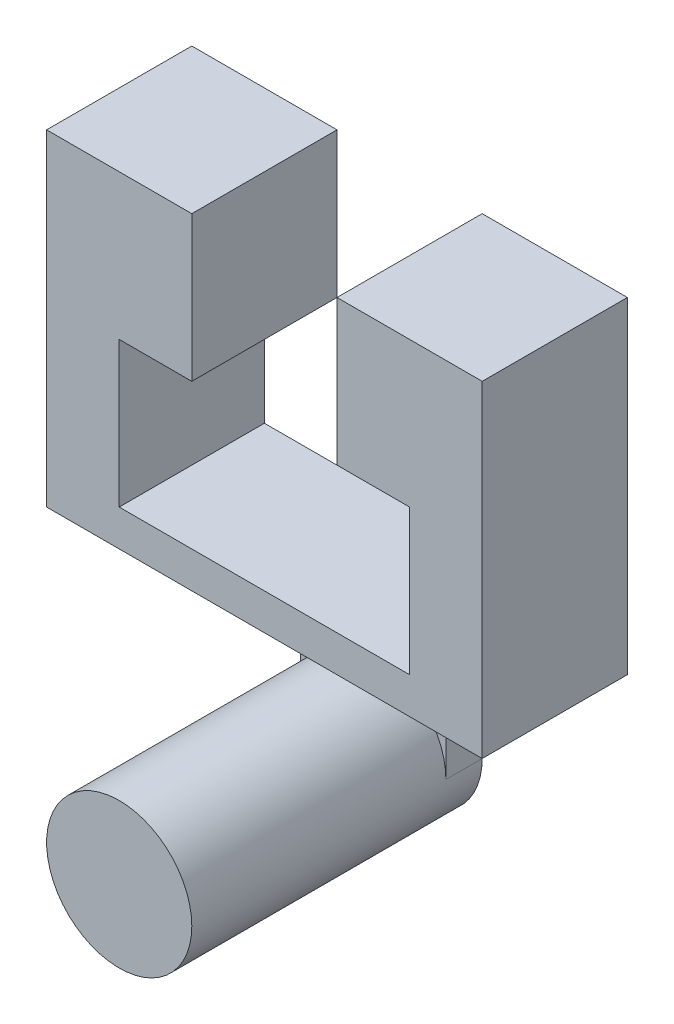
ISO-10303-21;
HEADER;
FILE_DESCRIPTION(('STEP AP214'),'2;1');
FILE_NAME('part.step','',(''),(''),'','','');
FILE_SCHEMA(('AUTOMOTIVE_DESIGN { 1 0 10303 214 1 1 1 1 }'));
ENDSEC;
DATA;
#1=APPLICATION_CONTEXT('core data for automotive mechanical design processes');
#2=APPLICATION_PROTOCOL_DEFINITION('international standard','automotive_design',2000,#1);
#3=PRODUCT_CONTEXT('',#1,'mechanical');
#4=PRODUCT('Part','Part','',(#3));
#5=PRODUCT_RELATED_PRODUCT_CATEGORY('part','',(#4));
#6=PRODUCT_DEFINITION_FORMATION('','',#4);
#7=PRODUCT_DEFINITION_CONTEXT('part definition',#1,'design');
#8=PRODUCT_DEFINITION('design','',#6,#7);
#9=PRODUCT_DEFINITION_SHAPE('','',#8);
#10=(LENGTH_UNIT() NAMED_UNIT(*) SI_UNIT(.MILLI.,.METRE.));
#11=(NAMED_UNIT(*) PLANE_ANGLE_UNIT() SI_UNIT($,.RADIAN.));
#12=(NAMED_UNIT(*) SI_UNIT($,.STERADIAN.) SOLID_ANGLE_UNIT());
#13=UNCERTAINTY_MEASURE_WITH_UNIT(LENGTH_MEASURE(1.E-05),#10,'distance_accuracy_value','');
#14=(GEOMETRIC_REPRESENTATION_CONTEXT(3) GLOBAL_UNCERTAINTY_ASSIGNED_CONTEXT((#13)) GLOBAL_UNIT_ASSIGNED_CONTEXT((#10,
#11,#12)) REPRESENTATION_CONTEXT('',''));
#15=CARTESIAN_POINT('',(0.,0.,0.));
#16=DIRECTION('',(0.,0.,1.));
#17=DIRECTION('',(1.,0.,0.));
#18=AXIS2_PLACEMENT_3D('',#15,#16,#17);
#19=CARTESIAN_POINT('',(38.1,82.55,25.4));
#20=DIRECTION('',(0.,-1.,0.));
#21=DIRECTION('',(0.,0.,-1.));
#22=AXIS2_PLACEMENT_3D('',#19,#20,#21);
#23=PLANE('',#22);
#24=DIRECTION('',(0.,0.,1.));
#25=VECTOR('',#24,1.);
#26=CARTESIAN_POINT('',(-12.7,82.55,0.));
#27=LINE('',#26,#25);
#28=CARTESIAN_POINT('',(-12.7,82.55,0.));
#29=VERTEX_POINT('',#28);
#30=CARTESIAN_POINT('',(-12.7,82.55,25.4));
#31=VERTEX_POINT('',#30);
#32=EDGE_CURVE('E161',#29,#31,#27,.T.);
#33=ORIENTED_EDGE('',*,*,#32,.F.);
#34=DIRECTION('',(-1.,0.,0.));
#35=VECTOR('',#34,1.);
#36=CARTESIAN_POINT('',(38.1,82.55,0.));
#37=LINE('',#36,#35);
#38=CARTESIAN_POINT('',(-38.1,82.55,0.));
#39=VERTEX_POINT('',#38);
#40=EDGE_CURVE('E175',#29,#39,#37,.T.);
#41=ORIENTED_EDGE('',*,*,#40,.T.);
#42=DIRECTION('',(0.,0.,-1.));
#43=VECTOR('',#42,1.);
#44=CARTESIAN_POINT('',(-38.1,82.55,25.4));
#45=LINE('',#44,#43);
#46=CARTESIAN_POINT('',(-38.1,82.55,25.4));
#47=VERTEX_POINT('',#46);
#48=EDGE_CURVE('E188',#47,#39,#45,.T.);
#49=ORIENTED_EDGE('',*,*,#48,.F.);
#50=DIRECTION('',(-1.,0.,0.));
#51=VECTOR('',#50,1.);
#52=CARTESIAN_POINT('',(38.1,82.55,25.4));
#53=LINE('',#52,#51);
#54=EDGE_CURVE('E171',#31,#47,#53,.T.);
#55=ORIENTED_EDGE('',*,*,#54,.F.);
#56=EDGE_LOOP('',(#33,#41,#49,#55));
#57=FACE_BOUND('',#56,.T.);
#58=ADVANCED_FACE('F39',(#57),#23,.F.);
#59=CARTESIAN_POINT('',(0.,0.,0.));
#60=DIRECTION('',(0.,0.,1.));
#61=DIRECTION('',(1.,0.,0.));
#62=AXIS2_PLACEMENT_3D('',#59,#60,#61);
#63=PLANE('',#62);
#64=DIRECTION('',(0.,1.,0.));
#65=VECTOR('',#64,1.);
#66=CARTESIAN_POINT('',(-12.7,57.15,0.));
#67=LINE('',#66,#65);
#68=CARTESIAN_POINT('',(-12.7,57.15,0.));
#69=VERTEX_POINT('',#68);
#70=EDGE_CURVE('E158',#69,#29,#67,.T.);
#71=ORIENTED_EDGE('',*,*,#70,.F.);
#72=DIRECTION('',(1.,0.,0.));
#73=VECTOR('',#72,1.);
#74=CARTESIAN_POINT('',(-25.4,57.15,0.));
#75=LINE('',#74,#73);
#76=CARTESIAN_POINT('',(-25.4,57.15,0.));
#77=VERTEX_POINT('',#76);
#78=EDGE_CURVE('E286',#77,#69,#75,.T.);
#79=ORIENTED_EDGE('',*,*,#78,.F.);
#80=DIRECTION('',(0.,1.,0.));
#81=VECTOR('',#80,1.);
#82=CARTESIAN_POINT('',(-25.4,31.75,0.));
#83=LINE('',#82,#81);
#84=CARTESIAN_POINT('',(-25.4,31.75,0.));
#85=VERTEX_POINT('',#84);
#86=EDGE_CURVE('E289',#85,#77,#83,.T.);
#87=ORIENTED_EDGE('',*,*,#86,.F.);
#88=DIRECTION('',(-1.,0.,0.));
#89=VECTOR('',#88,1.);
#90=CARTESIAN_POINT('',(25.4,31.75,0.));
#91=LINE('',#90,#89);
#92=CARTESIAN_POINT('',(25.4,31.75,0.));
#93=VERTEX_POINT('',#92);
#94=EDGE_CURVE('E283',#93,#85,#91,.T.);
#95=ORIENTED_EDGE('',*,*,#94,.F.);
#96=DIRECTION('',(0.,-1.,0.));
#97=VECTOR('',#96,1.);
#98=CARTESIAN_POINT('',(25.4,57.15,0.));
#99=LINE('',#98,#97);
#100=CARTESIAN_POINT('',(25.4,57.15,0.));
#101=VERTEX_POINT('',#100);
#102=EDGE_CURVE('E282',#101,#93,#99,.T.);
#103=ORIENTED_EDGE('',*,*,#102,.F.);
#104=DIRECTION('',(1.,0.,0.));
#105=VECTOR('',#104,1.);
#106=CARTESIAN_POINT('',(12.7,57.15,0.));
#107=LINE('',#106,#105);
#108=CARTESIAN_POINT('',(12.7,57.15,0.));
#109=VERTEX_POINT('',#108);
#110=EDGE_CURVE('E280',#109,#101,#107,.T.);
#111=ORIENTED_EDGE('',*,*,#110,.F.);
#112=DIRECTION('',(0.,-1.,0.));
#113=VECTOR('',#112,1.);
#114=CARTESIAN_POINT('',(12.7,82.55,0.));
#115=LINE('',#114,#113);
#116=CARTESIAN_POINT('',(12.7,82.55,0.));
#117=VERTEX_POINT('',#116);
#118=EDGE_CURVE('E167',#117,#109,#115,.T.);
#119=ORIENTED_EDGE('',*,*,#118,.F.);
#120=CARTESIAN_POINT('',(38.1,82.55,0.));
#121=VERTEX_POINT('',#120);
#122=EDGE_CURVE('E182',#121,#117,#37,.T.);
#123=ORIENTED_EDGE('',*,*,#122,.F.);
#124=DIRECTION('',(0.,1.,0.));
#125=VECTOR('',#124,1.);
#126=CARTESIAN_POINT('',(38.1,25.4,0.));
#127=LINE('',#126,#125);
#128=CARTESIAN_POINT('',(38.1,25.4,0.));
#129=VERTEX_POINT('',#128);
#130=EDGE_CURVE('E185',#129,#121,#127,.T.);
#131=ORIENTED_EDGE('',*,*,#130,.F.);
#132=DIRECTION('',(1.,0.,0.));
#133=VECTOR('',#132,1.);
#134=CARTESIAN_POINT('',(-38.1,25.4,0.));
#135=LINE('',#134,#133);
#136=CARTESIAN_POINT('',(12.7,25.4,0.));
#137=VERTEX_POINT('',#136);
#138=EDGE_CURVE('E226',#137,#129,#135,.T.);
#139=ORIENTED_EDGE('',*,*,#138,.F.);
#140=DIRECTION('',(0.,-1.,0.));
#141=VECTOR('',#140,1.);
#142=CARTESIAN_POINT('',(12.7,25.4,0.));
#143=LINE('',#142,#141);
#144=CARTESIAN_POINT('',(12.7,0.,0.));
#145=VERTEX_POINT('',#144);
#146=EDGE_CURVE('E206',#137,#145,#143,.T.);
#147=ORIENTED_EDGE('',*,*,#146,.T.);
#148=CARTESIAN_POINT('',(0.,0.,0.));
#149=DIRECTION('',(0.,0.,1.));
#150=DIRECTION('',(1.,0.,0.));
#151=AXIS2_PLACEMENT_3D('',#148,#149,#150);
#152=CIRCLE('',#151,12.7);
#153=CARTESIAN_POINT('',(-12.7,0.,0.));
#154=VERTEX_POINT('',#153);
#155=EDGE_CURVE('E205',#154,#145,#152,.T.);
#156=ORIENTED_EDGE('',*,*,#155,.F.);
#157=DIRECTION('',(0.,1.,0.));
#158=VECTOR('',#157,1.);
#159=CARTESIAN_POINT('',(-12.7,0.,0.));
#160=LINE('',#159,#158);
#161=CARTESIAN_POINT('',(-12.7,25.4,0.));
#162=VERTEX_POINT('',#161);
#163=EDGE_CURVE('E211',#154,#162,#160,.T.);
#164=ORIENTED_EDGE('',*,*,#163,.T.);
#165=CARTESIAN_POINT('',(-38.1,25.4,0.));
#166=VERTEX_POINT('',#165);
#167=EDGE_CURVE('E187',#166,#162,#135,.T.);
#168=ORIENTED_EDGE('',*,*,#167,.F.);
#169=DIRECTION('',(0.,-1.,0.));
#170=VECTOR('',#169,1.);
#171=CARTESIAN_POINT('',(-38.1,82.55,0.));
#172=LINE('',#171,#170);
#173=EDGE_CURVE('E173',#39,#166,#172,.T.);
#174=ORIENTED_EDGE('',*,*,#173,.F.);
#175=ORIENTED_EDGE('',*,*,#40,.F.);
#176=EDGE_LOOP('',(#71,#79,#87,#95,#103,#111,#119,#123,#131,#139,#147,#156,#164,#168,#174,#175));
#177=FACE_BOUND('',#176,.T.);
#178=ADVANCED_FACE('F176',(#177),#63,.F.);
#179=CARTESIAN_POINT('',(0.,0.,25.4));
#180=DIRECTION('',(0.,0.,1.));
#181=DIRECTION('',(1.,0.,0.));
#182=AXIS2_PLACEMENT_3D('',#179,#180,#181);
#183=PLANE('',#182);
#184=DIRECTION('',(1.,0.,0.));
#185=VECTOR('',#184,1.);
#186=CARTESIAN_POINT('',(-25.4,57.15,25.4));
#187=LINE('',#186,#185);
#188=CARTESIAN_POINT('',(-25.4,57.15,25.4));
#189=VERTEX_POINT('',#188);
#190=CARTESIAN_POINT('',(-12.7,57.15,25.4));
#191=VERTEX_POINT('',#190);
#192=EDGE_CURVE('E170',#189,#191,#187,.T.);
#193=ORIENTED_EDGE('',*,*,#192,.T.);
#194=DIRECTION('',(0.,1.,0.));
#195=VECTOR('',#194,1.);
#196=CARTESIAN_POINT('',(-12.7,57.15,25.4));
#197=LINE('',#196,#195);
#198=EDGE_CURVE('E57',#191,#31,#197,.T.);
#199=ORIENTED_EDGE('',*,*,#198,.T.);
#200=ORIENTED_EDGE('',*,*,#54,.T.);
#201=DIRECTION('',(0.,-1.,0.));
#202=VECTOR('',#201,1.);
#203=CARTESIAN_POINT('',(-38.1,82.55,25.4));
#204=LINE('',#203,#202);
#205=CARTESIAN_POINT('',(-38.1,25.4,25.4));
#206=VERTEX_POINT('',#205);
#207=EDGE_CURVE('E183',#47,#206,#204,.T.);
#208=ORIENTED_EDGE('',*,*,#207,.T.);
#209=DIRECTION('',(1.,0.,0.));
#210=VECTOR('',#209,1.);
#211=CARTESIAN_POINT('',(-38.1,25.4,25.4));
#212=LINE('',#211,#210);
#213=CARTESIAN_POINT('',(38.1,25.4,25.4));
#214=VERTEX_POINT('',#213);
#215=EDGE_CURVE('E323',#206,#214,#212,.T.);
#216=ORIENTED_EDGE('',*,*,#215,.T.);
#217=DIRECTION('',(0.,1.,0.));
#218=VECTOR('',#217,1.);
#219=CARTESIAN_POINT('',(38.1,25.4,25.4));
#220=LINE('',#219,#218);
#221=CARTESIAN_POINT('',(38.1,82.55,25.4));
#222=VERTEX_POINT('',#221);
#223=EDGE_CURVE('E324',#214,#222,#220,.T.);
#224=ORIENTED_EDGE('',*,*,#223,.T.);
#225=CARTESIAN_POINT('',(12.7,82.55,25.4));
#226=VERTEX_POINT('',#225);
#227=EDGE_CURVE('E195',#222,#226,#53,.T.);
#228=ORIENTED_EDGE('',*,*,#227,.T.);
#229=DIRECTION('',(0.,-1.,0.));
#230=VECTOR('',#229,1.);
#231=CARTESIAN_POINT('',(12.7,82.55,25.4));
#232=LINE('',#231,#230);
#233=CARTESIAN_POINT('',(12.7,57.15,25.4));
#234=VERTEX_POINT('',#233);
#235=EDGE_CURVE('E295',#226,#234,#232,.T.);
#236=ORIENTED_EDGE('',*,*,#235,.T.);
#237=DIRECTION('',(1.,0.,0.));
#238=VECTOR('',#237,1.);
#239=CARTESIAN_POINT('',(12.7,57.15,25.4));
#240=LINE('',#239,#238);
#241=CARTESIAN_POINT('',(25.4,57.15,25.4));
#242=VERTEX_POINT('',#241);
#243=EDGE_CURVE('E293',#234,#242,#240,.T.);
#244=ORIENTED_EDGE('',*,*,#243,.T.);
#245=DIRECTION('',(0.,-1.,0.));
#246=VECTOR('',#245,1.);
#247=CARTESIAN_POINT('',(25.4,57.15,25.4));
#248=LINE('',#247,#246);
#249=CARTESIAN_POINT('',(25.4,31.75,25.4));
#250=VERTEX_POINT('',#249);
#251=EDGE_CURVE('E299',#242,#250,#248,.T.);
#252=ORIENTED_EDGE('',*,*,#251,.T.);
#253=DIRECTION('',(-1.,0.,0.));
#254=VECTOR('',#253,1.);
#255=CARTESIAN_POINT('',(25.4,31.75,25.4));
#256=LINE('',#255,#254);
#257=CARTESIAN_POINT('',(-25.4,31.75,25.4));
#258=VERTEX_POINT('',#257);
#259=EDGE_CURVE('E302',#250,#258,#256,.T.);
#260=ORIENTED_EDGE('',*,*,#259,.T.);
#261=DIRECTION('',(0.,1.,0.));
#262=VECTOR('',#261,1.);
#263=CARTESIAN_POINT('',(-25.4,31.75,25.4));
#264=LINE('',#263,#262);
#265=EDGE_CURVE('E301',#258,#189,#264,.T.);
#266=ORIENTED_EDGE('',*,*,#265,.T.);
#267=EDGE_LOOP('',(#193,#199,#200,#208,#216,#224,#228,#236,#244,#252,#260,#266));
#268=FACE_BOUND('',#267,.T.);
#269=ADVANCED_FACE('F254',(#268),#183,.T.);
#270=CARTESIAN_POINT('',(12.7,25.4,6.35));
#271=DIRECTION('',(1.,0.,0.));
#272=DIRECTION('',(0.,1.,0.));
#273=AXIS2_PLACEMENT_3D('',#270,#271,#272);
#274=PLANE('',#273);
#275=ORIENTED_EDGE('',*,*,#146,.F.);
#276=DIRECTION('',(0.,0.,-1.));
#277=VECTOR('',#276,1.);
#278=CARTESIAN_POINT('',(12.7,25.4,6.35));
#279=LINE('',#278,#277);
#280=CARTESIAN_POINT('',(12.7,25.4,6.35));
#281=VERTEX_POINT('',#280);
#282=EDGE_CURVE('E11',#281,#137,#279,.T.);
#283=ORIENTED_EDGE('',*,*,#282,.F.);
#284=DIRECTION('',(0.,-1.,0.));
#285=VECTOR('',#284,1.);
#286=CARTESIAN_POINT('',(12.7,25.4,6.35));
#287=LINE('',#286,#285);
#288=CARTESIAN_POINT('',(12.7,0.,6.35));
#289=VERTEX_POINT('',#288);
#290=EDGE_CURVE('E207',#281,#289,#287,.T.);
#291=ORIENTED_EDGE('',*,*,#290,.T.);
#292=DIRECTION('',(0.,0.,-1.));
#293=VECTOR('',#292,1.);
#294=CARTESIAN_POINT('',(12.7,0.,6.35));
#295=LINE('',#294,#293);
#296=EDGE_CURVE('E43',#289,#145,#295,.T.);
#297=ORIENTED_EDGE('',*,*,#296,.T.);
#298=EDGE_LOOP('',(#275,#283,#291,#297));
#299=FACE_BOUND('',#298,.T.);
#300=ADVANCED_FACE('F41',(#299),#274,.T.);
#301=CARTESIAN_POINT('',(-12.7,0.,6.35));
#302=DIRECTION('',(-1.,0.,0.));
#303=DIRECTION('',(0.,-1.,0.));
#304=AXIS2_PLACEMENT_3D('',#301,#302,#303);
#305=PLANE('',#304);
#306=ORIENTED_EDGE('',*,*,#163,.F.);
#307=DIRECTION('',(0.,0.,-1.));
#308=VECTOR('',#307,1.);
#309=CARTESIAN_POINT('',(-12.7,0.,6.35));
#310=LINE('',#309,#308);
#311=CARTESIAN_POINT('',(-12.7,0.,6.35));
#312=VERTEX_POINT('',#311);
#313=EDGE_CURVE('E222',#312,#154,#310,.T.);
#314=ORIENTED_EDGE('',*,*,#313,.F.);
#315=DIRECTION('',(0.,1.,0.));
#316=VECTOR('',#315,1.);
#317=CARTESIAN_POINT('',(-12.7,0.,6.35));
#318=LINE('',#317,#316);
#319=CARTESIAN_POINT('',(-12.7,25.4,6.35));
#320=VERTEX_POINT('',#319);
#321=EDGE_CURVE('E213',#312,#320,#318,.T.);
#322=ORIENTED_EDGE('',*,*,#321,.T.);
#323=DIRECTION('',(0.,0.,-1.));
#324=VECTOR('',#323,1.);
#325=CARTESIAN_POINT('',(-12.7,25.4,6.35));
#326=LINE('',#325,#324);
#327=EDGE_CURVE('E48',#320,#162,#326,.T.);
#328=ORIENTED_EDGE('',*,*,#327,.T.);
#329=EDGE_LOOP('',(#306,#314,#322,#328));
#330=FACE_BOUND('',#329,.T.);
#331=ADVANCED_FACE('F364',(#330),#305,.T.);
#332=CARTESIAN_POINT('',(0.,0.,6.35));
#333=DIRECTION('',(0.,0.,1.));
#334=DIRECTION('',(1.,0.,0.));
#335=AXIS2_PLACEMENT_3D('',#332,#333,#334);
#336=PLANE('',#335);
#337=ORIENTED_EDGE('',*,*,#290,.F.);
#338=DIRECTION('',(1.,0.,0.));
#339=VECTOR('',#338,1.);
#340=CARTESIAN_POINT('',(-12.7,25.4,6.35));
#341=LINE('',#340,#339);
#342=EDGE_CURVE('E214',#320,#281,#341,.T.);
#343=ORIENTED_EDGE('',*,*,#342,.F.);
#344=ORIENTED_EDGE('',*,*,#321,.F.);
#345=CARTESIAN_POINT('',(0.,0.,6.35));
#346=DIRECTION('',(0.,0.,1.));
#347=DIRECTION('',(1.,0.,0.));
#348=AXIS2_PLACEMENT_3D('',#345,#346,#347);
#349=CIRCLE('',#348,12.7);
#350=EDGE_CURVE('E83',#289,#312,#349,.T.);
#351=ORIENTED_EDGE('',*,*,#350,.F.);
#352=EDGE_LOOP('',(#337,#343,#344,#351));
#353=FACE_BOUND('',#352,.T.);
#354=ADVANCED_FACE('F231',(#353),#336,.T.);
#355=CARTESIAN_POINT('',(0.,0.,50.8));
#356=DIRECTION('',(0.,0.,-1.));
#357=DIRECTION('',(-1.,0.,0.));
#358=AXIS2_PLACEMENT_3D('',#355,#356,#357);
#359=CYLINDRICAL_SURFACE('',#358,12.7);
#360=ORIENTED_EDGE('',*,*,#296,.F.);
#361=ORIENTED_EDGE('',*,*,#350,.T.);
#362=ORIENTED_EDGE('',*,*,#313,.T.);
#363=ORIENTED_EDGE('',*,*,#155,.T.);
#364=EDGE_LOOP('',(#360,#361,#362,#363));
#365=FACE_BOUND('',#364,.T.);
#366=CARTESIAN_POINT('',(0.,0.,50.8));
#367=DIRECTION('',(0.,0.,1.));
#368=DIRECTION('',(1.,0.,0.));
#369=AXIS2_PLACEMENT_3D('',#366,#367,#368);
#370=CIRCLE('',#369,12.7);
#371=CARTESIAN_POINT('',(12.7,0.,50.8));
#372=VERTEX_POINT('',#371);
#373=EDGE_CURVE('E201',#372,#372,#370,.T.);
#374=ORIENTED_EDGE('',*,*,#373,.F.);
#375=EDGE_LOOP('',(#374));
#376=FACE_BOUND('',#375,.T.);
#377=ADVANCED_FACE('F228',(#365,#376),#359,.T.);
#378=CARTESIAN_POINT('',(0.,0.,50.8));
#379=DIRECTION('',(0.,0.,1.));
#380=DIRECTION('',(1.,0.,0.));
#381=AXIS2_PLACEMENT_3D('',#378,#379,#380);
#382=PLANE('',#381);
#383=ORIENTED_EDGE('',*,*,#373,.T.);
#384=EDGE_LOOP('',(#383));
#385=FACE_BOUND('',#384,.T.);
#386=ADVANCED_FACE('F235',(#385),#382,.T.);
#387=CARTESIAN_POINT('',(-38.1,82.55,25.4));
#388=DIRECTION('',(1.,0.,0.));
#389=DIRECTION('',(0.,1.,0.));
#390=AXIS2_PLACEMENT_3D('',#387,#388,#389);
#391=PLANE('',#390);
#392=ORIENTED_EDGE('',*,*,#173,.T.);
#393=DIRECTION('',(0.,0.,-1.));
#394=VECTOR('',#393,1.);
#395=CARTESIAN_POINT('',(-38.1,25.4,25.4));
#396=LINE('',#395,#394);
#397=EDGE_CURVE('E200',#206,#166,#396,.T.);
#398=ORIENTED_EDGE('',*,*,#397,.F.);
#399=ORIENTED_EDGE('',*,*,#207,.F.);
#400=ORIENTED_EDGE('',*,*,#48,.T.);
#401=EDGE_LOOP('',(#392,#398,#399,#400));
#402=FACE_BOUND('',#401,.T.);
#403=ADVANCED_FACE('F239',(#402),#391,.F.);
#404=CARTESIAN_POINT('',(-38.1,25.4,25.4));
#405=DIRECTION('',(0.,1.,0.));
#406=DIRECTION('',(0.,0.,1.));
#407=AXIS2_PLACEMENT_3D('',#404,#405,#406);
#408=PLANE('',#407);
#409=ORIENTED_EDGE('',*,*,#327,.F.);
#410=ORIENTED_EDGE('',*,*,#342,.T.);
#411=ORIENTED_EDGE('',*,*,#282,.T.);
#412=ORIENTED_EDGE('',*,*,#138,.T.);
#413=DIRECTION('',(0.,0.,-1.));
#414=VECTOR('',#413,1.);
#415=CARTESIAN_POINT('',(38.1,25.4,25.4));
#416=LINE('',#415,#414);
#417=EDGE_CURVE('E198',#214,#129,#416,.T.);
#418=ORIENTED_EDGE('',*,*,#417,.F.);
#419=ORIENTED_EDGE('',*,*,#215,.F.);
#420=ORIENTED_EDGE('',*,*,#397,.T.);
#421=ORIENTED_EDGE('',*,*,#167,.T.);
#422=EDGE_LOOP('',(#409,#410,#411,#412,#418,#419,#420,#421));
#423=FACE_BOUND('',#422,.T.);
#424=ADVANCED_FACE('F243',(#423),#408,.F.);
#425=CARTESIAN_POINT('',(38.1,25.4,25.4));
#426=DIRECTION('',(-1.,0.,0.));
#427=DIRECTION('',(0.,-1.,0.));
#428=AXIS2_PLACEMENT_3D('',#425,#426,#427);
#429=PLANE('',#428);
#430=ORIENTED_EDGE('',*,*,#130,.T.);
#431=DIRECTION('',(0.,0.,-1.));
#432=VECTOR('',#431,1.);
#433=CARTESIAN_POINT('',(38.1,82.55,25.4));
#434=LINE('',#433,#432);
#435=EDGE_CURVE('E194',#222,#121,#434,.T.);
#436=ORIENTED_EDGE('',*,*,#435,.F.);
#437=ORIENTED_EDGE('',*,*,#223,.F.);
#438=ORIENTED_EDGE('',*,*,#417,.T.);
#439=EDGE_LOOP('',(#430,#436,#437,#438));
#440=FACE_BOUND('',#439,.T.);
#441=ADVANCED_FACE('F257',(#440),#429,.F.);
#442=ORIENTED_EDGE('',*,*,#122,.T.);
#443=DIRECTION('',(0.,0.,1.));
#444=VECTOR('',#443,1.);
#445=CARTESIAN_POINT('',(12.7,82.55,0.));
#446=LINE('',#445,#444);
#447=EDGE_CURVE('E177',#117,#226,#446,.T.);
#448=ORIENTED_EDGE('',*,*,#447,.T.);
#449=ORIENTED_EDGE('',*,*,#227,.F.);
#450=ORIENTED_EDGE('',*,*,#435,.T.);
#451=EDGE_LOOP('',(#442,#448,#449,#450));
#452=FACE_BOUND('',#451,.T.);
#453=ADVANCED_FACE('F248',(#452),#23,.F.);
#454=CARTESIAN_POINT('',(-12.7,57.15,0.));
#455=DIRECTION('',(1.,0.,0.));
#456=DIRECTION('',(0.,0.,-1.));
#457=AXIS2_PLACEMENT_3D('',#454,#455,#456);
#458=PLANE('',#457);
#459=ORIENTED_EDGE('',*,*,#198,.F.);
#460=DIRECTION('',(0.,0.,1.));
#461=VECTOR('',#460,1.);
#462=CARTESIAN_POINT('',(-12.7,57.15,0.));
#463=LINE('',#462,#461);
#464=EDGE_CURVE('E165',#69,#191,#463,.T.);
#465=ORIENTED_EDGE('',*,*,#464,.F.);
#466=ORIENTED_EDGE('',*,*,#70,.T.);
#467=ORIENTED_EDGE('',*,*,#32,.T.);
#468=EDGE_LOOP('',(#459,#465,#466,#467));
#469=FACE_BOUND('',#468,.T.);
#470=ADVANCED_FACE('F159',(#469),#458,.T.);
#471=CARTESIAN_POINT('',(12.7,82.55,0.));
#472=DIRECTION('',(-1.,0.,0.));
#473=DIRECTION('',(0.,-1.,0.));
#474=AXIS2_PLACEMENT_3D('',#471,#472,#473);
#475=PLANE('',#474);
#476=ORIENTED_EDGE('',*,*,#235,.F.);
#477=ORIENTED_EDGE('',*,*,#447,.F.);
#478=ORIENTED_EDGE('',*,*,#118,.T.);
#479=DIRECTION('',(0.,0.,1.));
#480=VECTOR('',#479,1.);
#481=CARTESIAN_POINT('',(12.7,57.15,0.));
#482=LINE('',#481,#480);
#483=EDGE_CURVE('E318',#109,#234,#482,.T.);
#484=ORIENTED_EDGE('',*,*,#483,.T.);
#485=EDGE_LOOP('',(#476,#477,#478,#484));
#486=FACE_BOUND('',#485,.T.);
#487=ADVANCED_FACE('F266',(#486),#475,.T.);
#488=CARTESIAN_POINT('',(12.7,57.15,0.));
#489=DIRECTION('',(0.,-1.,0.));
#490=DIRECTION('',(0.,0.,-1.));
#491=AXIS2_PLACEMENT_3D('',#488,#489,#490);
#492=PLANE('',#491);
#493=ORIENTED_EDGE('',*,*,#243,.F.);
#494=ORIENTED_EDGE('',*,*,#483,.F.);
#495=ORIENTED_EDGE('',*,*,#110,.T.);
#496=DIRECTION('',(0.,0.,1.));
#497=VECTOR('',#496,1.);
#498=CARTESIAN_POINT('',(25.4,57.15,0.));
#499=LINE('',#498,#497);
#500=EDGE_CURVE('E316',#101,#242,#499,.T.);
#501=ORIENTED_EDGE('',*,*,#500,.T.);
#502=EDGE_LOOP('',(#493,#494,#495,#501));
#503=FACE_BOUND('',#502,.T.);
#504=ADVANCED_FACE('F353',(#503),#492,.T.);
#505=CARTESIAN_POINT('',(25.4,57.15,0.));
#506=DIRECTION('',(-1.,0.,0.));
#507=DIRECTION('',(0.,0.,1.));
#508=AXIS2_PLACEMENT_3D('',#505,#506,#507);
#509=PLANE('',#508);
#510=ORIENTED_EDGE('',*,*,#251,.F.);
#511=ORIENTED_EDGE('',*,*,#500,.F.);
#512=ORIENTED_EDGE('',*,*,#102,.T.);
#513=DIRECTION('',(0.,0.,1.));
#514=VECTOR('',#513,1.);
#515=CARTESIAN_POINT('',(25.4,31.75,0.));
#516=LINE('',#515,#514);
#517=EDGE_CURVE('E314',#93,#250,#516,.T.);
#518=ORIENTED_EDGE('',*,*,#517,.T.);
#519=EDGE_LOOP('',(#510,#511,#512,#518));
#520=FACE_BOUND('',#519,.T.);
#521=ADVANCED_FACE('F352',(#520),#509,.T.);
#522=CARTESIAN_POINT('',(25.4,31.75,0.));
#523=DIRECTION('',(0.,1.,0.));
#524=DIRECTION('',(-1.,0.,0.));
#525=AXIS2_PLACEMENT_3D('',#522,#523,#524);
#526=PLANE('',#525);
#527=ORIENTED_EDGE('',*,*,#259,.F.);
#528=ORIENTED_EDGE('',*,*,#517,.F.);
#529=ORIENTED_EDGE('',*,*,#94,.T.);
#530=DIRECTION('',(0.,0.,1.));
#531=VECTOR('',#530,1.);
#532=CARTESIAN_POINT('',(-25.4,31.75,0.));
#533=LINE('',#532,#531);
#534=EDGE_CURVE('E315',#85,#258,#533,.T.);
#535=ORIENTED_EDGE('',*,*,#534,.T.);
#536=EDGE_LOOP('',(#527,#528,#529,#535));
#537=FACE_BOUND('',#536,.T.);
#538=ADVANCED_FACE('F350',(#537),#526,.T.);
#539=CARTESIAN_POINT('',(-25.4,31.75,0.));
#540=DIRECTION('',(1.,0.,0.));
#541=DIRECTION('',(0.,1.,0.));
#542=AXIS2_PLACEMENT_3D('',#539,#540,#541);
#543=PLANE('',#542);
#544=ORIENTED_EDGE('',*,*,#265,.F.);
#545=ORIENTED_EDGE('',*,*,#534,.F.);
#546=ORIENTED_EDGE('',*,*,#86,.T.);
#547=DIRECTION('',(0.,0.,1.));
#548=VECTOR('',#547,1.);
#549=CARTESIAN_POINT('',(-25.4,57.15,0.));
#550=LINE('',#549,#548);
#551=EDGE_CURVE('E309',#77,#189,#550,.T.);
#552=ORIENTED_EDGE('',*,*,#551,.T.);
#553=EDGE_LOOP('',(#544,#545,#546,#552));
#554=FACE_BOUND('',#553,.T.);
#555=ADVANCED_FACE('F341',(#554),#543,.T.);
#556=CARTESIAN_POINT('',(-25.4,57.15,0.));
#557=DIRECTION('',(0.,-1.,0.));
#558=DIRECTION('',(0.,0.,-1.));
#559=AXIS2_PLACEMENT_3D('',#556,#557,#558);
#560=PLANE('',#559);
#561=ORIENTED_EDGE('',*,*,#192,.F.);
#562=ORIENTED_EDGE('',*,*,#551,.F.);
#563=ORIENTED_EDGE('',*,*,#78,.T.);
#564=ORIENTED_EDGE('',*,*,#464,.T.);
#565=EDGE_LOOP('',(#561,#562,#563,#564));
#566=FACE_BOUND('',#565,.T.);
#567=ADVANCED_FACE('F336',(#566),#560,.T.);
#568=CLOSED_SHELL('',(#58,#178,#269,#300,#331,#354,#377,#386,#403,#424,#441,#453,#470,#487,#504,
#521,#538,#555,#567));
#569=MANIFOLD_SOLID_BREP('B2',#568);
#570=ADVANCED_BREP_SHAPE_REPRESENTATION('',(#18,#569),#14);
#571=SHAPE_DEFINITION_REPRESENTATION(#9,#570);
ENDSEC;
END-ISO-10303-21;
